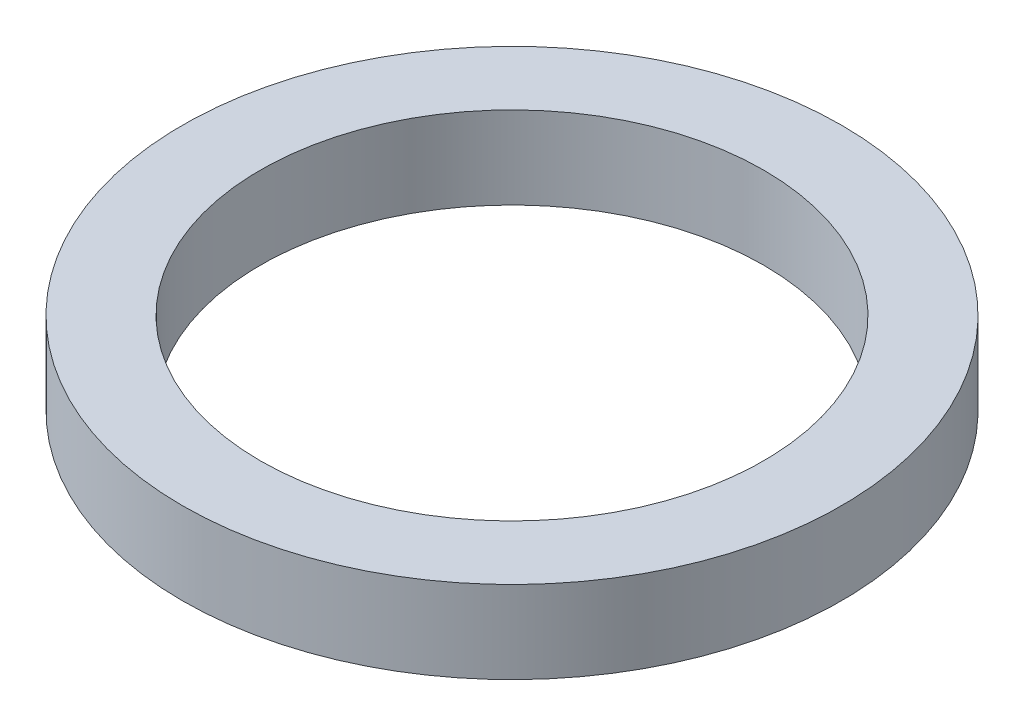
ISO-10303-21;
HEADER;
FILE_DESCRIPTION(('STEP AP214'),'2;1');
FILE_NAME('part.step','',(''),(''),'','','');
FILE_SCHEMA(('AUTOMOTIVE_DESIGN { 1 0 10303 214 1 1 1 1 }'));
ENDSEC;
DATA;
#1=APPLICATION_CONTEXT('core data for automotive mechanical design processes');
#2=APPLICATION_PROTOCOL_DEFINITION('international standard','automotive_design',2000,#1);
#3=PRODUCT_CONTEXT('',#1,'mechanical');
#4=PRODUCT('Part','Part','',(#3));
#5=PRODUCT_RELATED_PRODUCT_CATEGORY('part','',(#4));
#6=PRODUCT_DEFINITION_FORMATION('','',#4);
#7=PRODUCT_DEFINITION_CONTEXT('part definition',#1,'design');
#8=PRODUCT_DEFINITION('design','',#6,#7);
#9=PRODUCT_DEFINITION_SHAPE('','',#8);
#10=(LENGTH_UNIT() NAMED_UNIT(*) SI_UNIT(.MILLI.,.METRE.));
#11=(NAMED_UNIT(*) PLANE_ANGLE_UNIT() SI_UNIT($,.RADIAN.));
#12=(NAMED_UNIT(*) SI_UNIT($,.STERADIAN.) SOLID_ANGLE_UNIT());
#13=UNCERTAINTY_MEASURE_WITH_UNIT(LENGTH_MEASURE(1.E-05),#10,'distance_accuracy_value','');
#14=(GEOMETRIC_REPRESENTATION_CONTEXT(3) GLOBAL_UNCERTAINTY_ASSIGNED_CONTEXT((#13)) GLOBAL_UNIT_ASSIGNED_CONTEXT((#10,
#11,#12)) REPRESENTATION_CONTEXT('',''));
#15=CARTESIAN_POINT('',(0.,0.,0.));
#16=DIRECTION('',(0.,0.,1.));
#17=DIRECTION('',(1.,0.,0.));
#18=AXIS2_PLACEMENT_3D('',#15,#16,#17);
#19=CARTESIAN_POINT('',(0.,9.,0.));
#20=DIRECTION('',(0.,1.,0.));
#21=DIRECTION('',(0.,0.,1.));
#22=AXIS2_PLACEMENT_3D('',#19,#20,#21);
#23=PLANE('',#22);
#24=CARTESIAN_POINT('',(0.,9.,0.));
#25=DIRECTION('',(0.,1.,0.));
#26=DIRECTION('',(0.,0.,1.));
#27=AXIS2_PLACEMENT_3D('',#24,#25,#26);
#28=CIRCLE('',#27,36.);
#29=CARTESIAN_POINT('',(0.,9.,36.));
#30=VERTEX_POINT('',#29);
#31=EDGE_CURVE('E12',#30,#30,#28,.T.);
#32=ORIENTED_EDGE('',*,*,#31,.T.);
#33=EDGE_LOOP('',(#32));
#34=FACE_BOUND('',#33,.T.);
#35=CARTESIAN_POINT('',(0.,9.,0.));
#36=DIRECTION('',(0.,1.,0.));
#37=DIRECTION('',(0.,0.,1.));
#38=AXIS2_PLACEMENT_3D('',#35,#36,#37);
#39=CIRCLE('',#38,27.5);
#40=CARTESIAN_POINT('',(0.,9.,27.5));
#41=VERTEX_POINT('',#40);
#42=EDGE_CURVE('E54',#41,#41,#39,.T.);
#43=ORIENTED_EDGE('',*,*,#42,.F.);
#44=EDGE_LOOP('',(#43));
#45=FACE_BOUND('',#44,.T.);
#46=ADVANCED_FACE('F43',(#34,#45),#23,.T.);
#47=CARTESIAN_POINT('',(0.,0.,0.));
#48=DIRECTION('',(0.,1.,0.));
#49=DIRECTION('',(0.,0.,1.));
#50=AXIS2_PLACEMENT_3D('',#47,#48,#49);
#51=PLANE('',#50);
#52=CARTESIAN_POINT('',(0.,0.,0.));
#53=DIRECTION('',(0.,1.,0.));
#54=DIRECTION('',(0.,0.,1.));
#55=AXIS2_PLACEMENT_3D('',#52,#53,#54);
#56=CIRCLE('',#55,36.);
#57=CARTESIAN_POINT('',(0.,0.,36.));
#58=VERTEX_POINT('',#57);
#59=EDGE_CURVE('E47',#58,#58,#56,.T.);
#60=ORIENTED_EDGE('',*,*,#59,.F.);
#61=EDGE_LOOP('',(#60));
#62=FACE_BOUND('',#61,.T.);
#63=CARTESIAN_POINT('',(0.,0.,0.));
#64=DIRECTION('',(0.,1.,0.));
#65=DIRECTION('',(0.,0.,1.));
#66=AXIS2_PLACEMENT_3D('',#63,#64,#65);
#67=CIRCLE('',#66,27.5);
#68=CARTESIAN_POINT('',(0.,0.,27.5));
#69=VERTEX_POINT('',#68);
#70=EDGE_CURVE('E56',#69,#69,#67,.T.);
#71=ORIENTED_EDGE('',*,*,#70,.T.);
#72=EDGE_LOOP('',(#71));
#73=FACE_BOUND('',#72,.T.);
#74=ADVANCED_FACE('F66',(#62,#73),#51,.F.);
#75=CARTESIAN_POINT('',(0.,9.,0.));
#76=DIRECTION('',(0.,-1.,0.));
#77=DIRECTION('',(0.,0.,-1.));
#78=AXIS2_PLACEMENT_3D('',#75,#76,#77);
#79=CYLINDRICAL_SURFACE('',#78,36.);
#80=ORIENTED_EDGE('',*,*,#31,.F.);
#81=EDGE_LOOP('',(#80));
#82=FACE_BOUND('',#81,.T.);
#83=ORIENTED_EDGE('',*,*,#59,.T.);
#84=EDGE_LOOP('',(#83));
#85=FACE_BOUND('',#84,.T.);
#86=ADVANCED_FACE('F45',(#82,#85),#79,.T.);
#87=CARTESIAN_POINT('',(0.,9.,0.));
#88=DIRECTION('',(0.,-1.,0.));
#89=DIRECTION('',(0.,0.,-1.));
#90=AXIS2_PLACEMENT_3D('',#87,#88,#89);
#91=CYLINDRICAL_SURFACE('',#90,27.5);
#92=ORIENTED_EDGE('',*,*,#42,.T.);
#93=EDGE_LOOP('',(#92));
#94=FACE_BOUND('',#93,.T.);
#95=ORIENTED_EDGE('',*,*,#70,.F.);
#96=EDGE_LOOP('',(#95));
#97=FACE_BOUND('',#96,.T.);
#98=ADVANCED_FACE('F62',(#94,#97),#91,.F.);
#99=CLOSED_SHELL('',(#46,#74,#86,#98));
#100=MANIFOLD_SOLID_BREP('B2',#99);
#101=ADVANCED_BREP_SHAPE_REPRESENTATION('',(#18,#100),#14);
#102=SHAPE_DEFINITION_REPRESENTATION(#9,#101);
ENDSEC;
END-ISO-10303-21;
